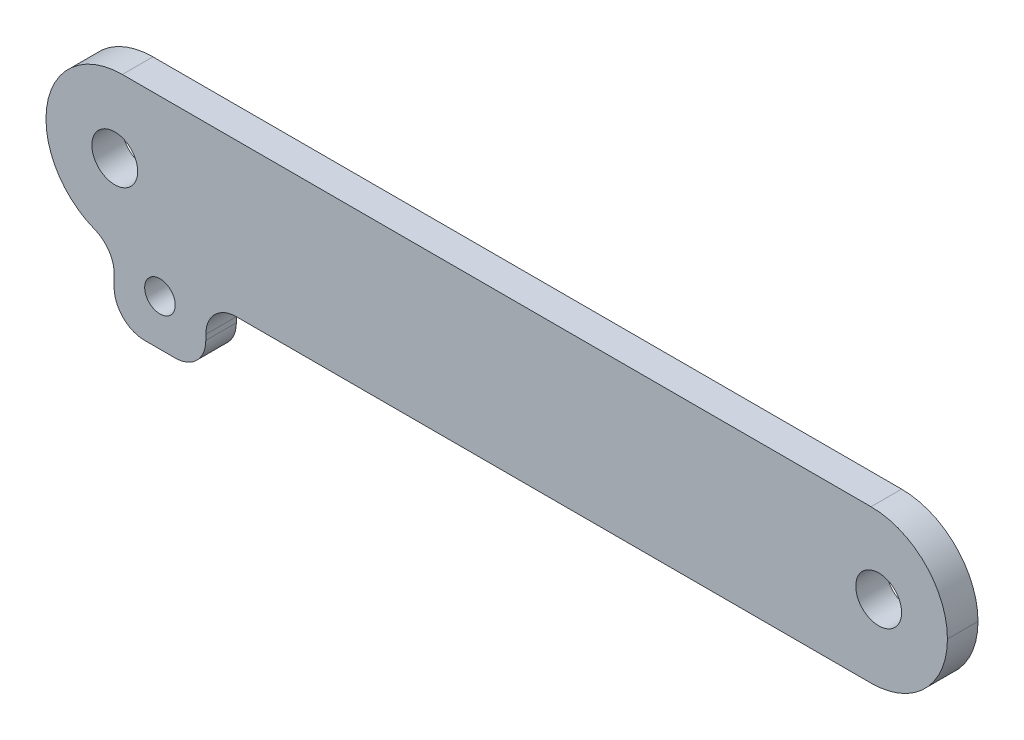
ISO-10303-21;
HEADER;
FILE_DESCRIPTION(('STEP AP214'),'2;1');
FILE_NAME('part.step','',(''),(''),'','','');
FILE_SCHEMA(('AUTOMOTIVE_DESIGN { 1 0 10303 214 1 1 1 1 }'));
ENDSEC;
DATA;
#1=APPLICATION_CONTEXT('core data for automotive mechanical design processes');
#2=APPLICATION_PROTOCOL_DEFINITION('international standard','automotive_design',2000,#1);
#3=PRODUCT_CONTEXT('',#1,'mechanical');
#4=PRODUCT('Part','Part','',(#3));
#5=PRODUCT_RELATED_PRODUCT_CATEGORY('part','',(#4));
#6=PRODUCT_DEFINITION_FORMATION('','',#4);
#7=PRODUCT_DEFINITION_CONTEXT('part definition',#1,'design');
#8=PRODUCT_DEFINITION('design','',#6,#7);
#9=PRODUCT_DEFINITION_SHAPE('','',#8);
#10=(LENGTH_UNIT() NAMED_UNIT(*) SI_UNIT(.MILLI.,.METRE.));
#11=(NAMED_UNIT(*) PLANE_ANGLE_UNIT() SI_UNIT($,.RADIAN.));
#12=(NAMED_UNIT(*) SI_UNIT($,.STERADIAN.) SOLID_ANGLE_UNIT());
#13=UNCERTAINTY_MEASURE_WITH_UNIT(LENGTH_MEASURE(1.E-05),#10,'distance_accuracy_value','');
#14=(GEOMETRIC_REPRESENTATION_CONTEXT(3) GLOBAL_UNCERTAINTY_ASSIGNED_CONTEXT((#13)) GLOBAL_UNIT_ASSIGNED_CONTEXT((#10,
#11,#12)) REPRESENTATION_CONTEXT('',''));
#15=CARTESIAN_POINT('',(0.,0.,0.));
#16=DIRECTION('',(0.,0.,1.));
#17=DIRECTION('',(1.,0.,0.));
#18=AXIS2_PLACEMENT_3D('',#15,#16,#17);
#19=CARTESIAN_POINT('',(0.,0.,2.));
#20=DIRECTION('',(0.,0.,-0.999999999999998));
#21=DIRECTION('',(-0.999999999999999,0.,0.));
#22=AXIS2_PLACEMENT_3D('',#19,#20,#21);
#23=PLANE('',#22);
#24=DIRECTION('',(0.,-0.999999999999999,0.));
#25=VECTOR('',#24,1.);
#26=CARTESIAN_POINT('',(4.45832783218478,0.,2.));
#27=LINE('',#26,#25);
#28=CARTESIAN_POINT('',(4.45832783218487,-1.55168954760052,2.));
#29=VERTEX_POINT('',#28);
#30=CARTESIAN_POINT('',(4.45832783218487,-2.34415450925656,2.));
#31=VERTEX_POINT('',#30);
#32=EDGE_CURVE('E173',#29,#31,#27,.T.);
#33=ORIENTED_EDGE('',*,*,#32,.T.);
#34=CARTESIAN_POINT('',(6.45832783218489,-2.34415450925655,2.));
#35=DIRECTION('',(0.,0.,-0.999999999999998));
#36=DIRECTION('',(-0.999999999999999,0.,0.));
#37=AXIS2_PLACEMENT_3D('',#34,#35,#36);
#38=CIRCLE('',#37,2.);
#39=CARTESIAN_POINT('',(6.45832783218488,-4.34415450925656,2.));
#40=VERTEX_POINT('',#39);
#41=EDGE_CURVE('E223',#31,#40,#38,.F.);
#42=ORIENTED_EDGE('',*,*,#41,.T.);
#43=DIRECTION('',(0.999999999999999,0.,0.));
#44=VECTOR('',#43,1.);
#45=CARTESIAN_POINT('',(4.45832783218489,-4.34415450925656,2.));
#46=LINE('',#45,#44);
#47=CARTESIAN_POINT('',(8.45832783218487,-4.34415450925656,2.));
#48=VERTEX_POINT('',#47);
#49=EDGE_CURVE('E177',#40,#48,#46,.T.);
#50=ORIENTED_EDGE('',*,*,#49,.T.);
#51=CARTESIAN_POINT('',(8.45832783218491,-2.34415450925657,2.));
#52=DIRECTION('',(0.,0.,-0.999999999999998));
#53=DIRECTION('',(-0.999999999999999,0.,0.));
#54=AXIS2_PLACEMENT_3D('',#51,#52,#53);
#55=CIRCLE('',#54,2.);
#56=CARTESIAN_POINT('',(10.4583278321849,-2.34415450925656,2.));
#57=VERTEX_POINT('',#56);
#58=EDGE_CURVE('E221',#48,#57,#55,.F.);
#59=ORIENTED_EDGE('',*,*,#58,.T.);
#60=DIRECTION('',(0.,0.999999999999999,0.));
#61=VECTOR('',#60,1.);
#62=CARTESIAN_POINT('',(10.4583278321849,-4.34415450925656,2.));
#63=LINE('',#62,#61);
#64=CARTESIAN_POINT('',(10.4583278321849,-2.00000000000001,2.));
#65=VERTEX_POINT('',#64);
#66=EDGE_CURVE('E252',#57,#65,#63,.T.);
#67=ORIENTED_EDGE('',*,*,#66,.T.);
#68=CARTESIAN_POINT('',(12.4583278321849,-2.,2.));
#69=DIRECTION('',(0.,0.,-0.999999999999998));
#70=DIRECTION('',(-0.999999999999999,0.,0.));
#71=AXIS2_PLACEMENT_3D('',#68,#69,#70);
#72=CIRCLE('',#71,2.);
#73=CARTESIAN_POINT('',(12.4583278321849,0.,2.));
#74=VERTEX_POINT('',#73);
#75=EDGE_CURVE('E13',#65,#74,#72,.T.);
#76=ORIENTED_EDGE('',*,*,#75,.T.);
#77=DIRECTION('',(0.999999999999999,0.,0.));
#78=VECTOR('',#77,1.);
#79=CARTESIAN_POINT('',(10.4583278321849,0.,2.));
#80=LINE('',#79,#78);
#81=CARTESIAN_POINT('',(54.,0.,2.));
#82=VERTEX_POINT('',#81);
#83=EDGE_CURVE('E248',#74,#82,#80,.T.);
#84=ORIENTED_EDGE('',*,*,#83,.T.);
#85=CARTESIAN_POINT('',(54.,4.99999999999999,2.));
#86=DIRECTION('',(0.,0.,-0.999999999999998));
#87=DIRECTION('',(-0.999999999999999,0.,0.));
#88=AXIS2_PLACEMENT_3D('',#85,#86,#87);
#89=CIRCLE('',#88,5.);
#90=CARTESIAN_POINT('',(59.,4.99999999999999,2.));
#91=VERTEX_POINT('',#90);
#92=EDGE_CURVE('E193',#82,#91,#89,.F.);
#93=ORIENTED_EDGE('',*,*,#92,.T.);
#94=CARTESIAN_POINT('',(54.,4.99999999999999,2.));
#95=DIRECTION('',(0.,0.,-0.999999999999998));
#96=DIRECTION('',(-0.999999999999999,0.,0.));
#97=AXIS2_PLACEMENT_3D('',#94,#95,#96);
#98=CIRCLE('',#97,5.);
#99=CARTESIAN_POINT('',(54.,9.99999999999997,2.));
#100=VERTEX_POINT('',#99);
#101=EDGE_CURVE('E191',#91,#100,#98,.F.);
#102=ORIENTED_EDGE('',*,*,#101,.T.);
#103=DIRECTION('',(-0.999999999999999,0.,0.));
#104=VECTOR('',#103,1.);
#105=CARTESIAN_POINT('',(0.,10.,2.));
#106=LINE('',#105,#104);
#107=CARTESIAN_POINT('',(5.,9.99999999999999,2.));
#108=VERTEX_POINT('',#107);
#109=EDGE_CURVE('E251',#100,#108,#106,.T.);
#110=ORIENTED_EDGE('',*,*,#109,.T.);
#111=CARTESIAN_POINT('',(5.,4.99999999999999,2.));
#112=DIRECTION('',(0.,0.,-0.999999999999998));
#113=DIRECTION('',(-0.999999999999999,0.,0.));
#114=AXIS2_PLACEMENT_3D('',#111,#112,#113);
#115=CIRCLE('',#114,5.);
#116=CARTESIAN_POINT('',(1.11022302462516E-13,4.99999999999999,2.));
#117=VERTEX_POINT('',#116);
#118=EDGE_CURVE('E198',#108,#117,#115,.F.);
#119=ORIENTED_EDGE('',*,*,#118,.T.);
#120=DIRECTION('',(0.,-0.999999999999999,0.));
#121=VECTOR('',#120,1.);
#122=CARTESIAN_POINT('',(0.,0.,2.));
#123=LINE('',#122,#121);
#124=CARTESIAN_POINT('',(0.,4.97057252865445,2.));
#125=VERTEX_POINT('',#124);
#126=EDGE_CURVE('E165',#117,#125,#123,.T.);
#127=ORIENTED_EDGE('',*,*,#126,.T.);
#128=CARTESIAN_POINT('',(5.,4.97057252865446,2.));
#129=DIRECTION('',(0.,0.,-0.999999999999998));
#130=DIRECTION('',(-0.999999999999999,0.,0.));
#131=AXIS2_PLACEMENT_3D('',#128,#129,#130);
#132=CIRCLE('',#131,5.);
#133=CARTESIAN_POINT('',(3.18451988013206,0.311813902758041,2.));
#134=VERTEX_POINT('',#133);
#135=EDGE_CURVE('E195',#125,#134,#132,.F.);
#136=ORIENTED_EDGE('',*,*,#135,.T.);
#137=CARTESIAN_POINT('',(2.45832783218489,-1.55168954760052,2.));
#138=DIRECTION('',(0.,0.,-0.999999999999998));
#139=DIRECTION('',(-0.999999999999999,0.,0.));
#140=AXIS2_PLACEMENT_3D('',#137,#138,#139);
#141=CIRCLE('',#140,2.);
#142=EDGE_CURVE('E236',#134,#29,#141,.T.);
#143=ORIENTED_EDGE('',*,*,#142,.T.);
#144=EDGE_LOOP('',(#33,#42,#50,#59,#67,#76,#84,#93,#102,#110,#119,#127,#136,#143));
#145=FACE_BOUND('',#144,.T.);
#146=CARTESIAN_POINT('',(4.5,5.,2.));
#147=DIRECTION('',(0.,0.,0.999999999999998));
#148=DIRECTION('',(0.999999999999999,0.,0.));
#149=AXIS2_PLACEMENT_3D('',#146,#147,#148);
#150=CIRCLE('',#149,1.5);
#151=CARTESIAN_POINT('',(3.,5.,2.));
#152=VERTEX_POINT('',#151);
#153=EDGE_CURVE('E263',#152,#152,#150,.T.);
#154=ORIENTED_EDGE('',*,*,#153,.F.);
#155=EDGE_LOOP('',(#154));
#156=FACE_BOUND('',#155,.T.);
#157=CARTESIAN_POINT('',(54.4999999999999,4.99999999999999,2.));
#158=DIRECTION('',(0.,0.,0.999999999999998));
#159=DIRECTION('',(0.999999999999999,0.,0.));
#160=AXIS2_PLACEMENT_3D('',#157,#158,#159);
#161=CIRCLE('',#160,1.5);
#162=CARTESIAN_POINT('',(52.9999999999999,4.99999999999999,2.));
#163=VERTEX_POINT('',#162);
#164=EDGE_CURVE('E280',#163,#163,#161,.T.);
#165=ORIENTED_EDGE('',*,*,#164,.F.);
#166=EDGE_LOOP('',(#165));
#167=FACE_BOUND('',#166,.T.);
#168=CARTESIAN_POINT('',(7.45832783218488,-1.34415450925656,2.));
#169=DIRECTION('',(0.,0.,0.999999999999998));
#170=DIRECTION('',(0.999999999999999,0.,0.));
#171=AXIS2_PLACEMENT_3D('',#168,#169,#170);
#172=CIRCLE('',#171,1.);
#173=CARTESIAN_POINT('',(6.45832783218488,-1.34415450925656,2.));
#174=VERTEX_POINT('',#173);
#175=EDGE_CURVE('E286',#174,#174,#172,.T.);
#176=ORIENTED_EDGE('',*,*,#175,.F.);
#177=EDGE_LOOP('',(#176));
#178=FACE_BOUND('',#177,.T.);
#179=ADVANCED_FACE('F44',(#145,#156,#167,#178),#23,.F.);
#180=CARTESIAN_POINT('',(0.,0.,0.));
#181=DIRECTION('',(0.,0.,-0.999999999999998));
#182=DIRECTION('',(-0.999999999999999,0.,0.));
#183=AXIS2_PLACEMENT_3D('',#180,#181,#182);
#184=PLANE('',#183);
#185=CARTESIAN_POINT('',(54.4999999999999,4.99999999999999,0.));
#186=DIRECTION('',(0.,0.,0.999999999999998));
#187=DIRECTION('',(0.999999999999999,0.,0.));
#188=AXIS2_PLACEMENT_3D('',#185,#186,#187);
#189=CIRCLE('',#188,1.5);
#190=CARTESIAN_POINT('',(52.9999999999999,4.99999999999999,0.));
#191=VERTEX_POINT('',#190);
#192=EDGE_CURVE('E283',#191,#191,#189,.T.);
#193=ORIENTED_EDGE('',*,*,#192,.T.);
#194=EDGE_LOOP('',(#193));
#195=FACE_BOUND('',#194,.T.);
#196=DIRECTION('',(0.999999999999999,0.,0.));
#197=VECTOR('',#196,1.);
#198=CARTESIAN_POINT('',(4.45832783218489,-4.34415450925656,0.));
#199=LINE('',#198,#197);
#200=CARTESIAN_POINT('',(6.45832783218488,-4.34415450925656,0.));
#201=VERTEX_POINT('',#200);
#202=CARTESIAN_POINT('',(8.45832783218487,-4.34415450925656,0.));
#203=VERTEX_POINT('',#202);
#204=EDGE_CURVE('E244',#201,#203,#199,.T.);
#205=ORIENTED_EDGE('',*,*,#204,.F.);
#206=CARTESIAN_POINT('',(6.45832783218489,-2.34415450925655,0.));
#207=DIRECTION('',(0.,0.,-0.999999999999998));
#208=DIRECTION('',(-0.999999999999999,0.,0.));
#209=AXIS2_PLACEMENT_3D('',#206,#207,#208);
#210=CIRCLE('',#209,2.);
#211=CARTESIAN_POINT('',(4.45832783218487,-2.34415450925656,0.));
#212=VERTEX_POINT('',#211);
#213=EDGE_CURVE('E214',#201,#212,#210,.T.);
#214=ORIENTED_EDGE('',*,*,#213,.T.);
#215=DIRECTION('',(0.,-0.999999999999999,0.));
#216=VECTOR('',#215,1.);
#217=CARTESIAN_POINT('',(4.45832783218478,0.,0.));
#218=LINE('',#217,#216);
#219=CARTESIAN_POINT('',(4.45832783218487,-1.55168954760052,0.));
#220=VERTEX_POINT('',#219);
#221=EDGE_CURVE('E260',#220,#212,#218,.T.);
#222=ORIENTED_EDGE('',*,*,#221,.F.);
#223=CARTESIAN_POINT('',(2.45832783218489,-1.55168954760052,0.));
#224=DIRECTION('',(0.,0.,-0.999999999999998));
#225=DIRECTION('',(-0.999999999999999,0.,0.));
#226=AXIS2_PLACEMENT_3D('',#223,#224,#225);
#227=CIRCLE('',#226,2.);
#228=CARTESIAN_POINT('',(3.18451988013206,0.311813902758041,0.));
#229=VERTEX_POINT('',#228);
#230=EDGE_CURVE('E234',#220,#229,#227,.F.);
#231=ORIENTED_EDGE('',*,*,#230,.T.);
#232=CARTESIAN_POINT('',(5.,4.97057252865446,0.));
#233=DIRECTION('',(0.,0.,-0.999999999999998));
#234=DIRECTION('',(-0.999999999999999,0.,0.));
#235=AXIS2_PLACEMENT_3D('',#232,#233,#234);
#236=CIRCLE('',#235,5.);
#237=CARTESIAN_POINT('',(0.,4.97057252865445,0.));
#238=VERTEX_POINT('',#237);
#239=EDGE_CURVE('E156',#229,#238,#236,.T.);
#240=ORIENTED_EDGE('',*,*,#239,.T.);
#241=DIRECTION('',(0.,-0.999999999999999,0.));
#242=VECTOR('',#241,1.);
#243=CARTESIAN_POINT('',(0.,0.,0.));
#244=LINE('',#243,#242);
#245=CARTESIAN_POINT('',(1.11022302462516E-13,4.99999999999999,0.));
#246=VERTEX_POINT('',#245);
#247=EDGE_CURVE('E162',#246,#238,#244,.T.);
#248=ORIENTED_EDGE('',*,*,#247,.F.);
#249=CARTESIAN_POINT('',(5.,4.99999999999999,0.));
#250=DIRECTION('',(0.,0.,-0.999999999999998));
#251=DIRECTION('',(-0.999999999999999,0.,0.));
#252=AXIS2_PLACEMENT_3D('',#249,#250,#251);
#253=CIRCLE('',#252,5.);
#254=CARTESIAN_POINT('',(5.,9.99999999999999,0.));
#255=VERTEX_POINT('',#254);
#256=EDGE_CURVE('E145',#246,#255,#253,.T.);
#257=ORIENTED_EDGE('',*,*,#256,.T.);
#258=DIRECTION('',(-0.999999999999999,0.,0.));
#259=VECTOR('',#258,1.);
#260=CARTESIAN_POINT('',(0.,10.,0.));
#261=LINE('',#260,#259);
#262=CARTESIAN_POINT('',(54.,9.99999999999997,0.));
#263=VERTEX_POINT('',#262);
#264=EDGE_CURVE('E174',#263,#255,#261,.T.);
#265=ORIENTED_EDGE('',*,*,#264,.F.);
#266=CARTESIAN_POINT('',(54.,4.99999999999999,0.));
#267=DIRECTION('',(0.,0.,-0.999999999999998));
#268=DIRECTION('',(-0.999999999999999,0.,0.));
#269=AXIS2_PLACEMENT_3D('',#266,#267,#268);
#270=CIRCLE('',#269,5.);
#271=CARTESIAN_POINT('',(59.,4.99999999999999,0.));
#272=VERTEX_POINT('',#271);
#273=EDGE_CURVE('E166',#263,#272,#270,.T.);
#274=ORIENTED_EDGE('',*,*,#273,.T.);
#275=CARTESIAN_POINT('',(54.,4.99999999999999,0.));
#276=DIRECTION('',(0.,0.,-0.999999999999998));
#277=DIRECTION('',(-0.999999999999999,0.,0.));
#278=AXIS2_PLACEMENT_3D('',#275,#276,#277);
#279=CIRCLE('',#278,5.);
#280=CARTESIAN_POINT('',(54.,0.,0.));
#281=VERTEX_POINT('',#280);
#282=EDGE_CURVE('E185',#272,#281,#279,.T.);
#283=ORIENTED_EDGE('',*,*,#282,.T.);
#284=DIRECTION('',(0.999999999999999,0.,0.));
#285=VECTOR('',#284,1.);
#286=CARTESIAN_POINT('',(10.4583278321849,0.,0.));
#287=LINE('',#286,#285);
#288=CARTESIAN_POINT('',(12.4583278321849,0.,0.));
#289=VERTEX_POINT('',#288);
#290=EDGE_CURVE('E179',#289,#281,#287,.T.);
#291=ORIENTED_EDGE('',*,*,#290,.F.);
#292=CARTESIAN_POINT('',(12.4583278321849,-2.,0.));
#293=DIRECTION('',(0.,0.,-0.999999999999998));
#294=DIRECTION('',(-0.999999999999999,0.,0.));
#295=AXIS2_PLACEMENT_3D('',#292,#293,#294);
#296=CIRCLE('',#295,2.);
#297=CARTESIAN_POINT('',(10.4583278321849,-2.00000000000001,0.));
#298=VERTEX_POINT('',#297);
#299=EDGE_CURVE('E52',#289,#298,#296,.F.);
#300=ORIENTED_EDGE('',*,*,#299,.T.);
#301=DIRECTION('',(0.,0.999999999999999,0.));
#302=VECTOR('',#301,1.);
#303=CARTESIAN_POINT('',(10.4583278321849,-4.34415450925656,0.));
#304=LINE('',#303,#302);
#305=CARTESIAN_POINT('',(10.4583278321849,-2.34415450925656,0.));
#306=VERTEX_POINT('',#305);
#307=EDGE_CURVE('E239',#306,#298,#304,.T.);
#308=ORIENTED_EDGE('',*,*,#307,.F.);
#309=CARTESIAN_POINT('',(8.45832783218491,-2.34415450925657,0.));
#310=DIRECTION('',(0.,0.,-0.999999999999998));
#311=DIRECTION('',(-0.999999999999999,0.,0.));
#312=AXIS2_PLACEMENT_3D('',#309,#310,#311);
#313=CIRCLE('',#312,2.);
#314=EDGE_CURVE('E212',#306,#203,#313,.T.);
#315=ORIENTED_EDGE('',*,*,#314,.T.);
#316=EDGE_LOOP('',(#205,#214,#222,#231,#240,#248,#257,#265,#274,#283,#291,#300,#308,#315));
#317=FACE_BOUND('',#316,.T.);
#318=CARTESIAN_POINT('',(4.5,5.,0.));
#319=DIRECTION('',(0.,0.,0.999999999999998));
#320=DIRECTION('',(0.999999999999999,0.,0.));
#321=AXIS2_PLACEMENT_3D('',#318,#319,#320);
#322=CIRCLE('',#321,1.5);
#323=CARTESIAN_POINT('',(3.,5.,0.));
#324=VERTEX_POINT('',#323);
#325=EDGE_CURVE('E277',#324,#324,#322,.T.);
#326=ORIENTED_EDGE('',*,*,#325,.T.);
#327=EDGE_LOOP('',(#326));
#328=FACE_BOUND('',#327,.T.);
#329=CARTESIAN_POINT('',(7.45832783218488,-1.34415450925656,0.));
#330=DIRECTION('',(0.,0.,0.999999999999998));
#331=DIRECTION('',(0.999999999999999,0.,0.));
#332=AXIS2_PLACEMENT_3D('',#329,#330,#331);
#333=CIRCLE('',#332,1.);
#334=CARTESIAN_POINT('',(6.45832783218488,-1.34415450925656,0.));
#335=VERTEX_POINT('',#334);
#336=EDGE_CURVE('E207',#335,#335,#333,.T.);
#337=ORIENTED_EDGE('',*,*,#336,.T.);
#338=EDGE_LOOP('',(#337));
#339=FACE_BOUND('',#338,.T.);
#340=ADVANCED_FACE('F170',(#195,#317,#328,#339),#184,.T.);
#341=CARTESIAN_POINT('',(4.45832783218478,0.,2.));
#342=DIRECTION('',(0.999999999999999,0.,0.));
#343=DIRECTION('',(0.,0.999999999999999,0.));
#344=AXIS2_PLACEMENT_3D('',#341,#342,#343);
#345=PLANE('',#344);
#346=ORIENTED_EDGE('',*,*,#221,.T.);
#347=DIRECTION('',(0.,0.,-0.999999999999998));
#348=VECTOR('',#347,1.);
#349=CARTESIAN_POINT('',(4.45832783218487,-2.34415450925656,2.));
#350=LINE('',#349,#348);
#351=EDGE_CURVE('E219',#212,#31,#350,.F.);
#352=ORIENTED_EDGE('',*,*,#351,.T.);
#353=ORIENTED_EDGE('',*,*,#32,.F.);
#354=DIRECTION('',(0.,0.,-0.999999999999998));
#355=VECTOR('',#354,1.);
#356=CARTESIAN_POINT('',(4.45832783218487,-1.55168954760052,2.));
#357=LINE('',#356,#355);
#358=EDGE_CURVE('E216',#29,#220,#357,.T.);
#359=ORIENTED_EDGE('',*,*,#358,.T.);
#360=EDGE_LOOP('',(#346,#352,#353,#359));
#361=FACE_BOUND('',#360,.T.);
#362=ADVANCED_FACE('F302',(#361),#345,.F.);
#363=CARTESIAN_POINT('',(4.45832783218489,-4.34415450925656,2.));
#364=DIRECTION('',(0.,0.999999999999999,0.));
#365=DIRECTION('',(0.,0.,0.999999999999998));
#366=AXIS2_PLACEMENT_3D('',#363,#364,#365);
#367=PLANE('',#366);
#368=ORIENTED_EDGE('',*,*,#49,.F.);
#369=DIRECTION('',(0.,0.,-0.999999999999998));
#370=VECTOR('',#369,1.);
#371=CARTESIAN_POINT('',(6.45832783218488,-4.34415450925656,2.));
#372=LINE('',#371,#370);
#373=EDGE_CURVE('E209',#40,#201,#372,.T.);
#374=ORIENTED_EDGE('',*,*,#373,.T.);
#375=ORIENTED_EDGE('',*,*,#204,.T.);
#376=DIRECTION('',(0.,0.,-0.999999999999998));
#377=VECTOR('',#376,1.);
#378=CARTESIAN_POINT('',(8.45832783218487,-4.34415450925656,2.));
#379=LINE('',#378,#377);
#380=EDGE_CURVE('E203',#203,#48,#379,.F.);
#381=ORIENTED_EDGE('',*,*,#380,.T.);
#382=EDGE_LOOP('',(#368,#374,#375,#381));
#383=FACE_BOUND('',#382,.T.);
#384=ADVANCED_FACE('F268',(#383),#367,.F.);
#385=CARTESIAN_POINT('',(10.4583278321849,-4.34415450925656,2.));
#386=DIRECTION('',(-0.999999999999999,0.,0.));
#387=DIRECTION('',(0.,0.,0.999999999999998));
#388=AXIS2_PLACEMENT_3D('',#385,#386,#387);
#389=PLANE('',#388);
#390=ORIENTED_EDGE('',*,*,#66,.F.);
#391=DIRECTION('',(0.,0.,-0.999999999999998));
#392=VECTOR('',#391,1.);
#393=CARTESIAN_POINT('',(10.4583278321849,-2.34415450925656,2.));
#394=LINE('',#393,#392);
#395=EDGE_CURVE('E228',#57,#306,#394,.T.);
#396=ORIENTED_EDGE('',*,*,#395,.T.);
#397=ORIENTED_EDGE('',*,*,#307,.T.);
#398=DIRECTION('',(0.,0.,-0.999999999999998));
#399=VECTOR('',#398,1.);
#400=CARTESIAN_POINT('',(10.4583278321849,-2.00000000000001,2.));
#401=LINE('',#400,#399);
#402=EDGE_CURVE('E65',#298,#65,#401,.F.);
#403=ORIENTED_EDGE('',*,*,#402,.T.);
#404=EDGE_LOOP('',(#390,#396,#397,#403));
#405=FACE_BOUND('',#404,.T.);
#406=ADVANCED_FACE('F242',(#405),#389,.F.);
#407=CARTESIAN_POINT('',(10.4583278321849,0.,2.));
#408=DIRECTION('',(0.,0.999999999999999,0.));
#409=DIRECTION('',(0.,0.,0.999999999999998));
#410=AXIS2_PLACEMENT_3D('',#407,#408,#409);
#411=PLANE('',#410);
#412=ORIENTED_EDGE('',*,*,#83,.F.);
#413=DIRECTION('',(0.,0.,-0.999999999999998));
#414=VECTOR('',#413,1.);
#415=CARTESIAN_POINT('',(12.4583278321849,0.,0.));
#416=LINE('',#415,#414);
#417=EDGE_CURVE('E231',#74,#289,#416,.T.);
#418=ORIENTED_EDGE('',*,*,#417,.T.);
#419=ORIENTED_EDGE('',*,*,#290,.T.);
#420=DIRECTION('',(0.,0.,-0.999999999999998));
#421=VECTOR('',#420,1.);
#422=CARTESIAN_POINT('',(54.,0.,2.));
#423=LINE('',#422,#421);
#424=EDGE_CURVE('E200',#281,#82,#423,.F.);
#425=ORIENTED_EDGE('',*,*,#424,.T.);
#426=EDGE_LOOP('',(#412,#418,#419,#425));
#427=FACE_BOUND('',#426,.T.);
#428=ADVANCED_FACE('F247',(#427),#411,.F.);
#429=CARTESIAN_POINT('',(0.,10.,2.));
#430=DIRECTION('',(0.,-0.999999999999999,0.));
#431=DIRECTION('',(0.,0.,-0.999999999999998));
#432=AXIS2_PLACEMENT_3D('',#429,#430,#431);
#433=PLANE('',#432);
#434=ORIENTED_EDGE('',*,*,#264,.T.);
#435=DIRECTION('',(0.,0.,-0.999999999999998));
#436=VECTOR('',#435,1.);
#437=CARTESIAN_POINT('',(5.,9.99999999999999,2.));
#438=LINE('',#437,#436);
#439=EDGE_CURVE('E150',#255,#108,#438,.F.);
#440=ORIENTED_EDGE('',*,*,#439,.T.);
#441=ORIENTED_EDGE('',*,*,#109,.F.);
#442=DIRECTION('',(0.,0.,-0.999999999999998));
#443=VECTOR('',#442,1.);
#444=CARTESIAN_POINT('',(54.,9.99999999999997,2.));
#445=LINE('',#444,#443);
#446=EDGE_CURVE('E155',#100,#263,#445,.T.);
#447=ORIENTED_EDGE('',*,*,#446,.T.);
#448=EDGE_LOOP('',(#434,#440,#441,#447));
#449=FACE_BOUND('',#448,.T.);
#450=ADVANCED_FACE('F311',(#449),#433,.F.);
#451=CARTESIAN_POINT('',(0.,0.,2.));
#452=DIRECTION('',(0.999999999999999,0.,0.));
#453=DIRECTION('',(0.,0.,-0.999999999999998));
#454=AXIS2_PLACEMENT_3D('',#451,#452,#453);
#455=PLANE('',#454);
#456=ORIENTED_EDGE('',*,*,#126,.F.);
#457=DIRECTION('',(0.,0.,-0.999999999999998));
#458=VECTOR('',#457,1.);
#459=CARTESIAN_POINT('',(1.11022302462516E-13,4.99999999999999,2.));
#460=LINE('',#459,#458);
#461=EDGE_CURVE('E149',#117,#246,#460,.T.);
#462=ORIENTED_EDGE('',*,*,#461,.T.);
#463=ORIENTED_EDGE('',*,*,#247,.T.);
#464=DIRECTION('',(0.,0.,-0.999999999999998));
#465=VECTOR('',#464,1.);
#466=CARTESIAN_POINT('',(0.,4.97057252865445,2.));
#467=LINE('',#466,#465);
#468=EDGE_CURVE('E167',#238,#125,#467,.F.);
#469=ORIENTED_EDGE('',*,*,#468,.T.);
#470=EDGE_LOOP('',(#456,#462,#463,#469));
#471=FACE_BOUND('',#470,.T.);
#472=ADVANCED_FACE('F161',(#471),#455,.F.);
#473=CARTESIAN_POINT('',(4.5,5.,2.));
#474=DIRECTION('',(0.,0.,-0.999999999999998));
#475=DIRECTION('',(-0.999999999999999,0.,0.));
#476=AXIS2_PLACEMENT_3D('',#473,#474,#475);
#477=CYLINDRICAL_SURFACE('',#476,1.5);
#478=CARTESIAN_POINT('',(3.,5.,2.));
#479=CARTESIAN_POINT('',(3.,5.,1.97916666666667));
#480=CARTESIAN_POINT('',(3.,5.,1.95833333333333));
#481=CARTESIAN_POINT('',(3.,5.,1.91666666666667));
#482=CARTESIAN_POINT('',(3.,5.,1.89583333333333));
#483=CARTESIAN_POINT('',(3.,5.,1.85416666666667));
#484=CARTESIAN_POINT('',(3.,5.,1.83333333333333));
#485=CARTESIAN_POINT('',(3.,5.,1.79166666666667));
#486=CARTESIAN_POINT('',(3.,5.,1.77083333333333));
#487=CARTESIAN_POINT('',(3.,5.,1.72916666666667));
#488=CARTESIAN_POINT('',(3.,5.,1.70833333333333));
#489=CARTESIAN_POINT('',(3.,5.,1.66666666666667));
#490=CARTESIAN_POINT('',(3.,5.,1.64583333333333));
#491=CARTESIAN_POINT('',(3.,5.,1.60416666666667));
#492=CARTESIAN_POINT('',(3.,5.,1.58333333333333));
#493=CARTESIAN_POINT('',(3.,5.,1.54166666666667));
#494=CARTESIAN_POINT('',(3.,5.,1.52083333333333));
#495=CARTESIAN_POINT('',(3.,5.,1.47916666666667));
#496=CARTESIAN_POINT('',(3.,5.,1.45833333333333));
#497=CARTESIAN_POINT('',(3.,5.,1.41666666666667));
#498=CARTESIAN_POINT('',(3.,5.,1.39583333333333));
#499=CARTESIAN_POINT('',(3.,5.,1.35416666666667));
#500=CARTESIAN_POINT('',(3.,5.,1.33333333333333));
#501=CARTESIAN_POINT('',(3.,5.,1.29166666666667));
#502=CARTESIAN_POINT('',(3.,5.,1.27083333333333));
#503=CARTESIAN_POINT('',(3.,5.,1.22916666666667));
#504=CARTESIAN_POINT('',(3.,5.,1.20833333333333));
#505=CARTESIAN_POINT('',(3.,5.,1.16666666666667));
#506=CARTESIAN_POINT('',(3.,5.,1.14583333333333));
#507=CARTESIAN_POINT('',(3.,5.,1.10416666666667));
#508=CARTESIAN_POINT('',(3.,5.,1.08333333333333));
#509=CARTESIAN_POINT('',(3.,5.,1.04166666666667));
#510=CARTESIAN_POINT('',(3.,5.,1.02083333333333));
#511=CARTESIAN_POINT('',(3.,5.,0.979166666666666));
#512=CARTESIAN_POINT('',(3.,5.,0.958333333333333));
#513=CARTESIAN_POINT('',(3.,5.,0.916666666666666));
#514=CARTESIAN_POINT('',(3.,5.,0.895833333333333));
#515=CARTESIAN_POINT('',(3.,5.,0.854166666666666));
#516=CARTESIAN_POINT('',(3.,5.,0.833333333333333));
#517=CARTESIAN_POINT('',(3.,5.,0.791666666666666));
#518=CARTESIAN_POINT('',(3.,5.,0.770833333333333));
#519=CARTESIAN_POINT('',(3.,5.,0.729166666666666));
#520=CARTESIAN_POINT('',(3.,5.,0.708333333333333));
#521=CARTESIAN_POINT('',(3.,5.,0.666666666666666));
#522=CARTESIAN_POINT('',(3.,5.,0.645833333333333));
#523=CARTESIAN_POINT('',(3.,5.,0.604166666666666));
#524=CARTESIAN_POINT('',(3.,5.,0.583333333333333));
#525=CARTESIAN_POINT('',(3.,5.,0.541666666666666));
#526=CARTESIAN_POINT('',(3.,5.,0.520833333333333));
#527=CARTESIAN_POINT('',(3.,5.,0.479166666666666));
#528=CARTESIAN_POINT('',(3.,5.,0.458333333333333));
#529=CARTESIAN_POINT('',(3.,5.,0.416666666666666));
#530=CARTESIAN_POINT('',(3.,5.,0.395833333333333));
#531=CARTESIAN_POINT('',(3.,5.,0.354166666666666));
#532=CARTESIAN_POINT('',(3.,5.,0.333333333333333));
#533=CARTESIAN_POINT('',(3.,5.,0.291666666666666));
#534=CARTESIAN_POINT('',(3.,5.,0.270833333333333));
#535=CARTESIAN_POINT('',(3.,5.,0.229166666666666));
#536=CARTESIAN_POINT('',(3.,5.,0.208333333333333));
#537=CARTESIAN_POINT('',(3.,5.,0.166666666666666));
#538=CARTESIAN_POINT('',(3.,5.,0.145833333333333));
#539=CARTESIAN_POINT('',(3.,5.,0.104166666666666));
#540=CARTESIAN_POINT('',(3.,5.,0.0833333333333331));
#541=CARTESIAN_POINT('',(3.,5.,0.0416666666666666));
#542=CARTESIAN_POINT('',(3.,5.,0.0208333333333333));
#543=CARTESIAN_POINT('',(3.,5.,0.));
#544=B_SPLINE_CURVE_WITH_KNOTS('',3,(#478,#479,#480,#481,#482,#483,#484,#485,#486,#487,#488,
#489,#490,#491,#492,#493,#494,#495,#496,#497,#498,#499,#500,#501,#502,#503,#504,#505,#506,#507,
#508,#509,#510,#511,#512,#513,#514,#515,#516,#517,#518,#519,#520,#521,#522,#523,#524,#525,#526,
#527,#528,#529,#530,#531,#532,#533,#534,#535,#536,#537,#538,#539,#540,#541,#542,#543),
.UNSPECIFIED.,.F.,.F.,(4,2,2,2,2,2,2,2,2,2,2,2,2,2,2,2,2,2,2,2,2,2,2,2,2,2,2,2,2,2,2,2,4),(0.,
0.0625000000000003,0.125,0.1875,0.25,0.3125,0.375,0.4375,0.5,0.5625,0.625,0.6875,0.75,0.8125,
0.875,0.9375,1.,1.0625,1.125,1.1875,1.25,1.3125,1.375,1.4375,1.5,1.5625,1.625,1.6875,1.75,
1.8125,1.875,1.9375,2.),.UNSPECIFIED.);
#545=EDGE_CURVE('BSEAM306',#152,#324,#544,.T.);
#546=ORIENTED_EDGE('',*,*,#153,.T.);
#547=ORIENTED_EDGE('',*,*,#325,.F.);
#548=ORIENTED_EDGE('',*,*,#545,.T.);
#549=ORIENTED_EDGE('',*,*,#545,.F.);
#550=EDGE_LOOP('',(#546,#548,#547,#549));
#551=FACE_BOUND('',#550,.T.);
#552=ADVANCED_FACE('F306',(#551),#477,.F.);
#553=CARTESIAN_POINT('',(54.4999999999999,4.99999999999999,2.));
#554=DIRECTION('',(0.,0.,-0.999999999999998));
#555=DIRECTION('',(-0.999999999999999,0.,0.));
#556=AXIS2_PLACEMENT_3D('',#553,#554,#555);
#557=CYLINDRICAL_SURFACE('',#556,1.5);
#558=CARTESIAN_POINT('',(52.9999999999999,4.99999999999999,2.));
#559=CARTESIAN_POINT('',(52.9999999999999,4.99999999999999,1.97916666666667));
#560=CARTESIAN_POINT('',(52.9999999999999,4.99999999999999,1.95833333333333));
#561=CARTESIAN_POINT('',(52.9999999999999,4.99999999999999,1.91666666666667));
#562=CARTESIAN_POINT('',(52.9999999999999,4.99999999999999,1.89583333333333));
#563=CARTESIAN_POINT('',(52.9999999999999,4.99999999999999,1.85416666666667));
#564=CARTESIAN_POINT('',(52.9999999999999,4.99999999999999,1.83333333333333));
#565=CARTESIAN_POINT('',(52.9999999999999,4.99999999999999,1.79166666666667));
#566=CARTESIAN_POINT('',(52.9999999999999,4.99999999999999,1.77083333333333));
#567=CARTESIAN_POINT('',(52.9999999999999,4.99999999999999,1.72916666666667));
#568=CARTESIAN_POINT('',(52.9999999999999,4.99999999999999,1.70833333333333));
#569=CARTESIAN_POINT('',(52.9999999999999,4.99999999999999,1.66666666666667));
#570=CARTESIAN_POINT('',(52.9999999999999,4.99999999999999,1.64583333333333));
#571=CARTESIAN_POINT('',(52.9999999999999,4.99999999999999,1.60416666666667));
#572=CARTESIAN_POINT('',(52.9999999999999,4.99999999999999,1.58333333333333));
#573=CARTESIAN_POINT('',(52.9999999999999,4.99999999999999,1.54166666666667));
#574=CARTESIAN_POINT('',(52.9999999999999,4.99999999999999,1.52083333333333));
#575=CARTESIAN_POINT('',(52.9999999999999,4.99999999999999,1.47916666666667));
#576=CARTESIAN_POINT('',(52.9999999999999,4.99999999999999,1.45833333333333));
#577=CARTESIAN_POINT('',(52.9999999999999,4.99999999999999,1.41666666666667));
#578=CARTESIAN_POINT('',(52.9999999999999,4.99999999999999,1.39583333333333));
#579=CARTESIAN_POINT('',(52.9999999999999,4.99999999999999,1.35416666666667));
#580=CARTESIAN_POINT('',(52.9999999999999,4.99999999999999,1.33333333333333));
#581=CARTESIAN_POINT('',(52.9999999999999,4.99999999999999,1.29166666666667));
#582=CARTESIAN_POINT('',(52.9999999999999,4.99999999999999,1.27083333333333));
#583=CARTESIAN_POINT('',(52.9999999999999,4.99999999999999,1.22916666666667));
#584=CARTESIAN_POINT('',(52.9999999999999,4.99999999999999,1.20833333333333));
#585=CARTESIAN_POINT('',(52.9999999999999,4.99999999999999,1.16666666666667));
#586=CARTESIAN_POINT('',(52.9999999999999,4.99999999999999,1.14583333333333));
#587=CARTESIAN_POINT('',(52.9999999999999,4.99999999999999,1.10416666666667));
#588=CARTESIAN_POINT('',(52.9999999999999,4.99999999999999,1.08333333333333));
#589=CARTESIAN_POINT('',(52.9999999999999,4.99999999999999,1.04166666666667));
#590=CARTESIAN_POINT('',(52.9999999999999,4.99999999999999,1.02083333333333));
#591=CARTESIAN_POINT('',(52.9999999999999,4.99999999999999,0.979166666666666));
#592=CARTESIAN_POINT('',(52.9999999999999,4.99999999999999,0.958333333333333));
#593=CARTESIAN_POINT('',(52.9999999999999,4.99999999999999,0.916666666666666));
#594=CARTESIAN_POINT('',(52.9999999999999,4.99999999999999,0.895833333333333));
#595=CARTESIAN_POINT('',(52.9999999999999,4.99999999999999,0.854166666666666));
#596=CARTESIAN_POINT('',(52.9999999999999,4.99999999999999,0.833333333333333));
#597=CARTESIAN_POINT('',(52.9999999999999,4.99999999999999,0.791666666666666));
#598=CARTESIAN_POINT('',(52.9999999999999,4.99999999999999,0.770833333333333));
#599=CARTESIAN_POINT('',(52.9999999999999,4.99999999999999,0.729166666666666));
#600=CARTESIAN_POINT('',(52.9999999999999,4.99999999999999,0.708333333333333));
#601=CARTESIAN_POINT('',(52.9999999999999,4.99999999999999,0.666666666666666));
#602=CARTESIAN_POINT('',(52.9999999999999,4.99999999999999,0.645833333333333));
#603=CARTESIAN_POINT('',(52.9999999999999,4.99999999999999,0.604166666666666));
#604=CARTESIAN_POINT('',(52.9999999999999,4.99999999999999,0.583333333333333));
#605=CARTESIAN_POINT('',(52.9999999999999,4.99999999999999,0.541666666666666));
#606=CARTESIAN_POINT('',(52.9999999999999,4.99999999999999,0.520833333333333));
#607=CARTESIAN_POINT('',(52.9999999999999,4.99999999999999,0.479166666666666));
#608=CARTESIAN_POINT('',(52.9999999999999,4.99999999999999,0.458333333333333));
#609=CARTESIAN_POINT('',(52.9999999999999,4.99999999999999,0.416666666666666));
#610=CARTESIAN_POINT('',(52.9999999999999,4.99999999999999,0.395833333333333));
#611=CARTESIAN_POINT('',(52.9999999999999,4.99999999999999,0.354166666666666));
#612=CARTESIAN_POINT('',(52.9999999999999,4.99999999999999,0.333333333333333));
#613=CARTESIAN_POINT('',(52.9999999999999,4.99999999999999,0.291666666666666));
#614=CARTESIAN_POINT('',(52.9999999999999,4.99999999999999,0.270833333333333));
#615=CARTESIAN_POINT('',(52.9999999999999,4.99999999999999,0.229166666666666));
#616=CARTESIAN_POINT('',(52.9999999999999,4.99999999999999,0.208333333333333));
#617=CARTESIAN_POINT('',(52.9999999999999,4.99999999999999,0.166666666666666));
#618=CARTESIAN_POINT('',(52.9999999999999,4.99999999999999,0.145833333333333));
#619=CARTESIAN_POINT('',(52.9999999999999,4.99999999999999,0.104166666666666));
#620=CARTESIAN_POINT('',(52.9999999999999,4.99999999999999,0.0833333333333331));
#621=CARTESIAN_POINT('',(52.9999999999999,4.99999999999999,0.0416666666666666));
#622=CARTESIAN_POINT('',(52.9999999999999,4.99999999999999,0.0208333333333333));
#623=CARTESIAN_POINT('',(52.9999999999999,4.99999999999999,0.));
#624=B_SPLINE_CURVE_WITH_KNOTS('',3,(#558,#559,#560,#561,#562,#563,#564,#565,#566,#567,#568,
#569,#570,#571,#572,#573,#574,#575,#576,#577,#578,#579,#580,#581,#582,#583,#584,#585,#586,#587,
#588,#589,#590,#591,#592,#593,#594,#595,#596,#597,#598,#599,#600,#601,#602,#603,#604,#605,#606,
#607,#608,#609,#610,#611,#612,#613,#614,#615,#616,#617,#618,#619,#620,#621,#622,#623),
.UNSPECIFIED.,.F.,.F.,(4,2,2,2,2,2,2,2,2,2,2,2,2,2,2,2,2,2,2,2,2,2,2,2,2,2,2,2,2,2,2,2,4),(0.,
0.0625000000000003,0.125,0.1875,0.25,0.3125,0.375,0.4375,0.5,0.5625,0.625,0.6875,0.75,0.8125,
0.875,0.9375,1.,1.0625,1.125,1.1875,1.25,1.3125,1.375,1.4375,1.5,1.5625,1.625,1.6875,1.75,
1.8125,1.875,1.9375,2.),.UNSPECIFIED.);
#625=EDGE_CURVE('BSEAM384',#163,#191,#624,.T.);
#626=ORIENTED_EDGE('',*,*,#164,.T.);
#627=ORIENTED_EDGE('',*,*,#192,.F.);
#628=ORIENTED_EDGE('',*,*,#625,.T.);
#629=ORIENTED_EDGE('',*,*,#625,.F.);
#630=EDGE_LOOP('',(#626,#628,#627,#629));
#631=FACE_BOUND('',#630,.T.);
#632=ADVANCED_FACE('F384',(#631),#557,.F.);
#633=CARTESIAN_POINT('',(7.45832783218488,-1.34415450925656,2.));
#634=DIRECTION('',(0.,0.,-0.999999999999998));
#635=DIRECTION('',(-0.999999999999999,0.,0.));
#636=AXIS2_PLACEMENT_3D('',#633,#634,#635);
#637=CYLINDRICAL_SURFACE('',#636,1.);
#638=CARTESIAN_POINT('',(6.45832783218488,-1.34415450925656,2.));
#639=CARTESIAN_POINT('',(6.45832783218488,-1.34415450925656,1.97916666666667));
#640=CARTESIAN_POINT('',(6.45832783218488,-1.34415450925656,1.95833333333333));
#641=CARTESIAN_POINT('',(6.45832783218488,-1.34415450925656,1.91666666666667));
#642=CARTESIAN_POINT('',(6.45832783218488,-1.34415450925656,1.89583333333333));
#643=CARTESIAN_POINT('',(6.45832783218488,-1.34415450925656,1.85416666666667));
#644=CARTESIAN_POINT('',(6.45832783218488,-1.34415450925656,1.83333333333333));
#645=CARTESIAN_POINT('',(6.45832783218488,-1.34415450925656,1.79166666666667));
#646=CARTESIAN_POINT('',(6.45832783218488,-1.34415450925656,1.77083333333333));
#647=CARTESIAN_POINT('',(6.45832783218488,-1.34415450925656,1.72916666666667));
#648=CARTESIAN_POINT('',(6.45832783218488,-1.34415450925656,1.70833333333333));
#649=CARTESIAN_POINT('',(6.45832783218488,-1.34415450925656,1.66666666666667));
#650=CARTESIAN_POINT('',(6.45832783218488,-1.34415450925656,1.64583333333333));
#651=CARTESIAN_POINT('',(6.45832783218488,-1.34415450925656,1.60416666666667));
#652=CARTESIAN_POINT('',(6.45832783218488,-1.34415450925656,1.58333333333333));
#653=CARTESIAN_POINT('',(6.45832783218488,-1.34415450925656,1.54166666666667));
#654=CARTESIAN_POINT('',(6.45832783218488,-1.34415450925656,1.52083333333333));
#655=CARTESIAN_POINT('',(6.45832783218488,-1.34415450925656,1.47916666666667));
#656=CARTESIAN_POINT('',(6.45832783218488,-1.34415450925656,1.45833333333333));
#657=CARTESIAN_POINT('',(6.45832783218488,-1.34415450925656,1.41666666666667));
#658=CARTESIAN_POINT('',(6.45832783218488,-1.34415450925656,1.39583333333333));
#659=CARTESIAN_POINT('',(6.45832783218488,-1.34415450925656,1.35416666666667));
#660=CARTESIAN_POINT('',(6.45832783218488,-1.34415450925656,1.33333333333333));
#661=CARTESIAN_POINT('',(6.45832783218488,-1.34415450925656,1.29166666666667));
#662=CARTESIAN_POINT('',(6.45832783218488,-1.34415450925656,1.27083333333333));
#663=CARTESIAN_POINT('',(6.45832783218488,-1.34415450925656,1.22916666666667));
#664=CARTESIAN_POINT('',(6.45832783218488,-1.34415450925656,1.20833333333333));
#665=CARTESIAN_POINT('',(6.45832783218488,-1.34415450925656,1.16666666666667));
#666=CARTESIAN_POINT('',(6.45832783218488,-1.34415450925656,1.14583333333333));
#667=CARTESIAN_POINT('',(6.45832783218488,-1.34415450925656,1.10416666666667));
#668=CARTESIAN_POINT('',(6.45832783218488,-1.34415450925656,1.08333333333333));
#669=CARTESIAN_POINT('',(6.45832783218488,-1.34415450925656,1.04166666666667));
#670=CARTESIAN_POINT('',(6.45832783218488,-1.34415450925656,1.02083333333333));
#671=CARTESIAN_POINT('',(6.45832783218488,-1.34415450925656,0.979166666666666));
#672=CARTESIAN_POINT('',(6.45832783218488,-1.34415450925656,0.958333333333333));
#673=CARTESIAN_POINT('',(6.45832783218488,-1.34415450925656,0.916666666666666));
#674=CARTESIAN_POINT('',(6.45832783218488,-1.34415450925656,0.895833333333333));
#675=CARTESIAN_POINT('',(6.45832783218488,-1.34415450925656,0.854166666666666));
#676=CARTESIAN_POINT('',(6.45832783218488,-1.34415450925656,0.833333333333333));
#677=CARTESIAN_POINT('',(6.45832783218488,-1.34415450925656,0.791666666666666));
#678=CARTESIAN_POINT('',(6.45832783218488,-1.34415450925656,0.770833333333333));
#679=CARTESIAN_POINT('',(6.45832783218488,-1.34415450925656,0.729166666666666));
#680=CARTESIAN_POINT('',(6.45832783218488,-1.34415450925656,0.708333333333333));
#681=CARTESIAN_POINT('',(6.45832783218488,-1.34415450925656,0.666666666666666));
#682=CARTESIAN_POINT('',(6.45832783218488,-1.34415450925656,0.645833333333333));
#683=CARTESIAN_POINT('',(6.45832783218488,-1.34415450925656,0.604166666666666));
#684=CARTESIAN_POINT('',(6.45832783218488,-1.34415450925656,0.583333333333333));
#685=CARTESIAN_POINT('',(6.45832783218488,-1.34415450925656,0.541666666666666));
#686=CARTESIAN_POINT('',(6.45832783218488,-1.34415450925656,0.520833333333333));
#687=CARTESIAN_POINT('',(6.45832783218488,-1.34415450925656,0.479166666666666));
#688=CARTESIAN_POINT('',(6.45832783218488,-1.34415450925656,0.458333333333333));
#689=CARTESIAN_POINT('',(6.45832783218488,-1.34415450925656,0.416666666666666));
#690=CARTESIAN_POINT('',(6.45832783218488,-1.34415450925656,0.395833333333333));
#691=CARTESIAN_POINT('',(6.45832783218488,-1.34415450925656,0.354166666666666));
#692=CARTESIAN_POINT('',(6.45832783218488,-1.34415450925656,0.333333333333333));
#693=CARTESIAN_POINT('',(6.45832783218488,-1.34415450925656,0.291666666666666));
#694=CARTESIAN_POINT('',(6.45832783218488,-1.34415450925656,0.270833333333333));
#695=CARTESIAN_POINT('',(6.45832783218488,-1.34415450925656,0.229166666666666));
#696=CARTESIAN_POINT('',(6.45832783218488,-1.34415450925656,0.208333333333333));
#697=CARTESIAN_POINT('',(6.45832783218488,-1.34415450925656,0.166666666666666));
#698=CARTESIAN_POINT('',(6.45832783218488,-1.34415450925656,0.145833333333333));
#699=CARTESIAN_POINT('',(6.45832783218488,-1.34415450925656,0.104166666666666));
#700=CARTESIAN_POINT('',(6.45832783218488,-1.34415450925656,0.0833333333333331));
#701=CARTESIAN_POINT('',(6.45832783218488,-1.34415450925656,0.0416666666666666));
#702=CARTESIAN_POINT('',(6.45832783218488,-1.34415450925656,0.0208333333333333));
#703=CARTESIAN_POINT('',(6.45832783218488,-1.34415450925656,0.));
#704=B_SPLINE_CURVE_WITH_KNOTS('',3,(#638,#639,#640,#641,#642,#643,#644,#645,#646,#647,#648,
#649,#650,#651,#652,#653,#654,#655,#656,#657,#658,#659,#660,#661,#662,#663,#664,#665,#666,#667,
#668,#669,#670,#671,#672,#673,#674,#675,#676,#677,#678,#679,#680,#681,#682,#683,#684,#685,#686,
#687,#688,#689,#690,#691,#692,#693,#694,#695,#696,#697,#698,#699,#700,#701,#702,#703),
.UNSPECIFIED.,.F.,.F.,(4,2,2,2,2,2,2,2,2,2,2,2,2,2,2,2,2,2,2,2,2,2,2,2,2,2,2,2,2,2,2,2,4),(0.,
0.0625000000000003,0.125,0.1875,0.25,0.3125,0.375,0.4375,0.5,0.5625,0.625,0.6875,0.75,0.8125,
0.875,0.9375,1.,1.0625,1.125,1.1875,1.25,1.3125,1.375,1.4375,1.5,1.5625,1.625,1.6875,1.75,
1.8125,1.875,1.9375,2.),.UNSPECIFIED.);
#705=EDGE_CURVE('BSEAM294',#174,#335,#704,.T.);
#706=ORIENTED_EDGE('',*,*,#175,.T.);
#707=ORIENTED_EDGE('',*,*,#336,.F.);
#708=ORIENTED_EDGE('',*,*,#705,.T.);
#709=ORIENTED_EDGE('',*,*,#705,.F.);
#710=EDGE_LOOP('',(#706,#708,#707,#709));
#711=FACE_BOUND('',#710,.T.);
#712=ADVANCED_FACE('F294',(#711),#637,.F.);
#713=CARTESIAN_POINT('',(5.,4.99999999999999,2.));
#714=DIRECTION('',(0.,0.,-0.999999999999998));
#715=DIRECTION('',(-0.999999999999999,0.,0.));
#716=AXIS2_PLACEMENT_3D('',#713,#714,#715);
#717=CYLINDRICAL_SURFACE('',#716,5.);
#718=ORIENTED_EDGE('',*,*,#118,.F.);
#719=ORIENTED_EDGE('',*,*,#439,.F.);
#720=ORIENTED_EDGE('',*,*,#256,.F.);
#721=ORIENTED_EDGE('',*,*,#461,.F.);
#722=EDGE_LOOP('',(#718,#719,#720,#721));
#723=FACE_BOUND('',#722,.T.);
#724=ADVANCED_FACE('F148',(#723),#717,.T.);
#725=CARTESIAN_POINT('',(5.,4.97057252865446,2.));
#726=DIRECTION('',(0.,0.,-0.999999999999998));
#727=DIRECTION('',(-0.999999999999999,0.,0.));
#728=AXIS2_PLACEMENT_3D('',#725,#726,#727);
#729=CYLINDRICAL_SURFACE('',#728,5.);
#730=ORIENTED_EDGE('',*,*,#239,.F.);
#731=DIRECTION('',(0.,0.,-0.999999999999998));
#732=VECTOR('',#731,1.);
#733=CARTESIAN_POINT('',(3.18451988013206,0.311813902758041,2.));
#734=LINE('',#733,#732);
#735=EDGE_CURVE('E225',#229,#134,#734,.F.);
#736=ORIENTED_EDGE('',*,*,#735,.T.);
#737=ORIENTED_EDGE('',*,*,#135,.F.);
#738=ORIENTED_EDGE('',*,*,#468,.F.);
#739=EDGE_LOOP('',(#730,#736,#737,#738));
#740=FACE_BOUND('',#739,.T.);
#741=ADVANCED_FACE('F326',(#740),#729,.T.);
#742=CARTESIAN_POINT('',(54.,4.99999999999999,2.));
#743=DIRECTION('',(0.,0.,-0.999999999999998));
#744=DIRECTION('',(-0.999999999999999,0.,0.));
#745=AXIS2_PLACEMENT_3D('',#742,#743,#744);
#746=CYLINDRICAL_SURFACE('',#745,5.);
#747=ORIENTED_EDGE('',*,*,#446,.F.);
#748=ORIENTED_EDGE('',*,*,#101,.F.);
#749=DIRECTION('',(0.,0.,-0.999999999999998));
#750=VECTOR('',#749,1.);
#751=CARTESIAN_POINT('',(59.,4.99999999999999,2.));
#752=LINE('',#751,#750);
#753=EDGE_CURVE('E204',#272,#91,#752,.F.);
#754=ORIENTED_EDGE('',*,*,#753,.F.);
#755=ORIENTED_EDGE('',*,*,#273,.F.);
#756=EDGE_LOOP('',(#747,#748,#754,#755));
#757=FACE_BOUND('',#756,.T.);
#758=ADVANCED_FACE('F329',(#757),#746,.T.);
#759=CARTESIAN_POINT('',(54.,4.99999999999999,2.));
#760=DIRECTION('',(0.,0.,-0.999999999999998));
#761=DIRECTION('',(-0.999999999999999,0.,0.));
#762=AXIS2_PLACEMENT_3D('',#759,#760,#761);
#763=CYLINDRICAL_SURFACE('',#762,5.);
#764=ORIENTED_EDGE('',*,*,#92,.F.);
#765=ORIENTED_EDGE('',*,*,#424,.F.);
#766=ORIENTED_EDGE('',*,*,#282,.F.);
#767=ORIENTED_EDGE('',*,*,#753,.T.);
#768=EDGE_LOOP('',(#764,#765,#766,#767));
#769=FACE_BOUND('',#768,.T.);
#770=ADVANCED_FACE('F331',(#769),#763,.T.);
#771=CARTESIAN_POINT('',(6.45832783218489,-2.34415450925655,2.));
#772=DIRECTION('',(0.,0.,-0.999999999999998));
#773=DIRECTION('',(-0.999999999999999,0.,0.));
#774=AXIS2_PLACEMENT_3D('',#771,#772,#773);
#775=CYLINDRICAL_SURFACE('',#774,2.);
#776=ORIENTED_EDGE('',*,*,#41,.F.);
#777=ORIENTED_EDGE('',*,*,#351,.F.);
#778=ORIENTED_EDGE('',*,*,#213,.F.);
#779=ORIENTED_EDGE('',*,*,#373,.F.);
#780=EDGE_LOOP('',(#776,#777,#778,#779));
#781=FACE_BOUND('',#780,.T.);
#782=ADVANCED_FACE('F334',(#781),#775,.T.);
#783=CARTESIAN_POINT('',(2.45832783218489,-1.55168954760052,2.));
#784=DIRECTION('',(0.,0.,-0.999999999999998));
#785=DIRECTION('',(-0.999999999999999,0.,0.));
#786=AXIS2_PLACEMENT_3D('',#783,#784,#785);
#787=CYLINDRICAL_SURFACE('',#786,2.);
#788=ORIENTED_EDGE('',*,*,#142,.F.);
#789=ORIENTED_EDGE('',*,*,#735,.F.);
#790=ORIENTED_EDGE('',*,*,#230,.F.);
#791=ORIENTED_EDGE('',*,*,#358,.F.);
#792=EDGE_LOOP('',(#788,#789,#790,#791));
#793=FACE_BOUND('',#792,.T.);
#794=ADVANCED_FACE('F341',(#793),#787,.F.);
#795=CARTESIAN_POINT('',(8.45832783218491,-2.34415450925657,2.));
#796=DIRECTION('',(0.,0.,-0.999999999999998));
#797=DIRECTION('',(-0.999999999999999,0.,0.));
#798=AXIS2_PLACEMENT_3D('',#795,#796,#797);
#799=CYLINDRICAL_SURFACE('',#798,2.);
#800=ORIENTED_EDGE('',*,*,#58,.F.);
#801=ORIENTED_EDGE('',*,*,#380,.F.);
#802=ORIENTED_EDGE('',*,*,#314,.F.);
#803=ORIENTED_EDGE('',*,*,#395,.F.);
#804=EDGE_LOOP('',(#800,#801,#802,#803));
#805=FACE_BOUND('',#804,.T.);
#806=ADVANCED_FACE('F273',(#805),#799,.T.);
#807=CARTESIAN_POINT('',(12.4583278321849,-2.,2.));
#808=DIRECTION('',(0.,0.,0.999999999999998));
#809=DIRECTION('',(0.999999999999999,0.,0.));
#810=AXIS2_PLACEMENT_3D('',#807,#808,#809);
#811=CYLINDRICAL_SURFACE('',#810,2.);
#812=ORIENTED_EDGE('',*,*,#75,.F.);
#813=ORIENTED_EDGE('',*,*,#402,.F.);
#814=ORIENTED_EDGE('',*,*,#299,.F.);
#815=ORIENTED_EDGE('',*,*,#417,.F.);
#816=EDGE_LOOP('',(#812,#813,#814,#815));
#817=FACE_BOUND('',#816,.T.);
#818=ADVANCED_FACE('F46',(#817),#811,.F.);
#819=CLOSED_SHELL('',(#179,#340,#362,#384,#406,#428,#450,#472,#552,#632,#712,#724,#741,#758,
#770,#782,#794,#806,#818));
#820=MANIFOLD_SOLID_BREP('B2',#819);
#821=ADVANCED_BREP_SHAPE_REPRESENTATION('',(#18,#820),#14);
#822=SHAPE_DEFINITION_REPRESENTATION(#9,#821);
ENDSEC;
END-ISO-10303-21;
